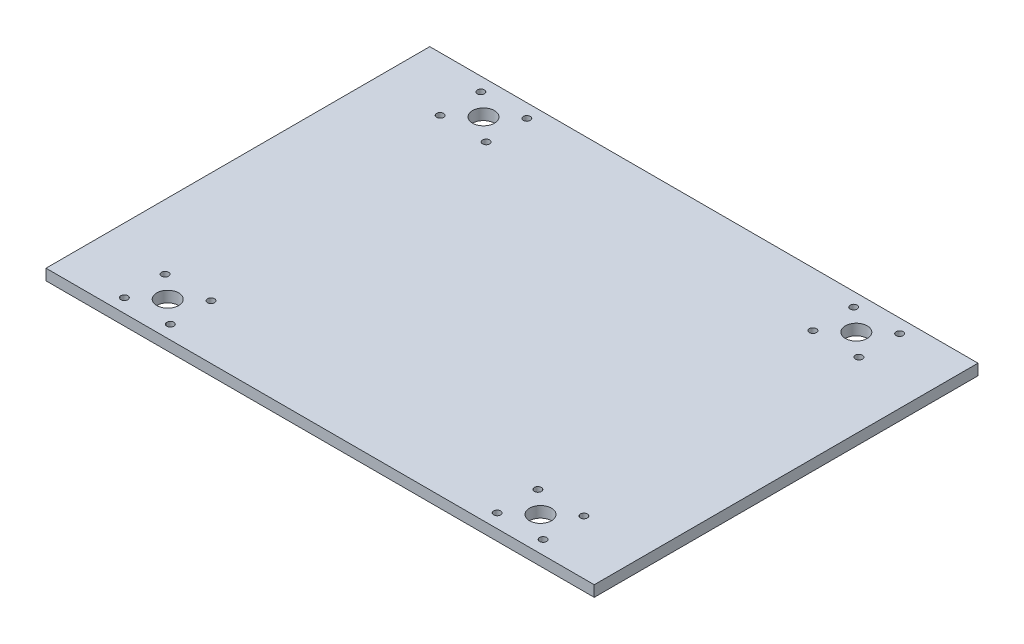
ISO-10303-21;
HEADER;
FILE_DESCRIPTION(('STEP AP214'),'2;1');
FILE_NAME('part.step','',(''),(''),'','','');
FILE_SCHEMA(('AUTOMOTIVE_DESIGN { 1 0 10303 214 1 1 1 1 }'));
ENDSEC;
DATA;
#1=APPLICATION_CONTEXT('core data for automotive mechanical design processes');
#2=APPLICATION_PROTOCOL_DEFINITION('international standard','automotive_design',2000,#1);
#3=PRODUCT_CONTEXT('',#1,'mechanical');
#4=PRODUCT('Part','Part','',(#3));
#5=PRODUCT_RELATED_PRODUCT_CATEGORY('part','',(#4));
#6=PRODUCT_DEFINITION_FORMATION('','',#4);
#7=PRODUCT_DEFINITION_CONTEXT('part definition',#1,'design');
#8=PRODUCT_DEFINITION('design','',#6,#7);
#9=PRODUCT_DEFINITION_SHAPE('','',#8);
#10=(LENGTH_UNIT() NAMED_UNIT(*) SI_UNIT(.MILLI.,.METRE.));
#11=(NAMED_UNIT(*) PLANE_ANGLE_UNIT() SI_UNIT($,.RADIAN.));
#12=(NAMED_UNIT(*) SI_UNIT($,.STERADIAN.) SOLID_ANGLE_UNIT());
#13=UNCERTAINTY_MEASURE_WITH_UNIT(LENGTH_MEASURE(1.E-05),#10,'distance_accuracy_value','');
#14=(GEOMETRIC_REPRESENTATION_CONTEXT(3) GLOBAL_UNCERTAINTY_ASSIGNED_CONTEXT((#13)) GLOBAL_UNIT_ASSIGNED_CONTEXT((#10,
#11,#12)) REPRESENTATION_CONTEXT('',''));
#15=CARTESIAN_POINT('',(0.,0.,0.));
#16=DIRECTION('',(0.,0.,1.));
#17=DIRECTION('',(1.,0.,0.));
#18=AXIS2_PLACEMENT_3D('',#15,#16,#17);
#19=CARTESIAN_POINT('',(0.,5.,0.));
#20=DIRECTION('',(0.,1.,0.));
#21=DIRECTION('',(0.,0.,1.));
#22=AXIS2_PLACEMENT_3D('',#19,#20,#21);
#23=PLANE('',#22);
#24=CARTESIAN_POINT('',(-74.5197654775757,5.,-81.2824934341472));
#25=DIRECTION('',(0.,1.,0.));
#26=DIRECTION('',(0.,0.,-1.));
#27=AXIS2_PLACEMENT_3D('',#24,#25,#26);
#28=CIRCLE('',#27,1.60000000000001);
#29=CARTESIAN_POINT('',(-74.5197654775757,5.,-82.8824934341472));
#30=VERTEX_POINT('',#29);
#31=EDGE_CURVE('E371',#30,#30,#28,.F.);
#32=ORIENTED_EDGE('',*,*,#31,.T.);
#33=EDGE_LOOP('',(#32));
#34=FACE_BOUND('',#33,.T.);
#35=CARTESIAN_POINT('',(-74.5197654775757,5.,-62.7175065658527));
#36=DIRECTION('',(0.,1.,0.));
#37=DIRECTION('',(0.,0.,-1.));
#38=AXIS2_PLACEMENT_3D('',#35,#36,#37);
#39=CIRCLE('',#38,1.60000000000001);
#40=CARTESIAN_POINT('',(-74.5197654775757,5.,-64.3175065658528));
#41=VERTEX_POINT('',#40);
#42=EDGE_CURVE('E377',#41,#41,#39,.T.);
#43=ORIENTED_EDGE('',*,*,#42,.F.);
#44=EDGE_LOOP('',(#43));
#45=FACE_BOUND('',#44,.T.);
#46=CARTESIAN_POINT('',(-85.,5.,-72.));
#47=DIRECTION('',(0.,1.,0.));
#48=DIRECTION('',(0.,0.,-1.));
#49=AXIS2_PLACEMENT_3D('',#46,#47,#48);
#50=CIRCLE('',#49,5.00000000000001);
#51=CARTESIAN_POINT('',(-85.,5.,-77.));
#52=VERTEX_POINT('',#51);
#53=EDGE_CURVE('E176',#52,#52,#50,.T.);
#54=ORIENTED_EDGE('',*,*,#53,.F.);
#55=EDGE_LOOP('',(#54));
#56=FACE_BOUND('',#55,.T.);
#57=CARTESIAN_POINT('',(-95.4802345224243,5.,81.2824934341472));
#58=DIRECTION('',(0.,-1.,0.));
#59=DIRECTION('',(0.,0.,1.));
#60=AXIS2_PLACEMENT_3D('',#57,#58,#59);
#61=CIRCLE('',#60,1.60000000000001);
#62=CARTESIAN_POINT('',(-95.4802345224243,5.,82.8824934341472));
#63=VERTEX_POINT('',#62);
#64=EDGE_CURVE('E190',#63,#63,#61,.T.);
#65=ORIENTED_EDGE('',*,*,#64,.T.);
#66=EDGE_LOOP('',(#65));
#67=FACE_BOUND('',#66,.T.);
#68=CARTESIAN_POINT('',(-74.5197654775757,5.,62.7175065658527));
#69=DIRECTION('',(0.,-1.,0.));
#70=DIRECTION('',(0.,0.,1.));
#71=AXIS2_PLACEMENT_3D('',#68,#69,#70);
#72=CIRCLE('',#71,1.60000000000001);
#73=CARTESIAN_POINT('',(-74.5197654775757,5.,64.3175065658528));
#74=VERTEX_POINT('',#73);
#75=EDGE_CURVE('E201',#74,#74,#72,.T.);
#76=ORIENTED_EDGE('',*,*,#75,.T.);
#77=EDGE_LOOP('',(#76));
#78=FACE_BOUND('',#77,.T.);
#79=CARTESIAN_POINT('',(-85.,5.,72.));
#80=DIRECTION('',(0.,-1.,0.));
#81=DIRECTION('',(0.,0.,1.));
#82=AXIS2_PLACEMENT_3D('',#79,#80,#81);
#83=CIRCLE('',#82,5.00000000000001);
#84=CARTESIAN_POINT('',(-85.,5.,77.));
#85=VERTEX_POINT('',#84);
#86=EDGE_CURVE('E159',#85,#85,#83,.T.);
#87=ORIENTED_EDGE('',*,*,#86,.T.);
#88=EDGE_LOOP('',(#87));
#89=FACE_BOUND('',#88,.T.);
#90=CARTESIAN_POINT('',(95.4802345224243,5.,-81.2824934341472));
#91=DIRECTION('',(0.,-1.,0.));
#92=DIRECTION('',(0.,0.,-1.));
#93=AXIS2_PLACEMENT_3D('',#90,#91,#92);
#94=CIRCLE('',#93,1.60000000000001);
#95=CARTESIAN_POINT('',(95.4802345224243,5.,-82.8824934341472));
#96=VERTEX_POINT('',#95);
#97=EDGE_CURVE('E208',#96,#96,#94,.T.);
#98=ORIENTED_EDGE('',*,*,#97,.T.);
#99=EDGE_LOOP('',(#98));
#100=FACE_BOUND('',#99,.T.);
#101=CARTESIAN_POINT('',(74.5197654775757,5.,-62.7175065658527));
#102=DIRECTION('',(0.,-1.,0.));
#103=DIRECTION('',(0.,0.,-1.));
#104=AXIS2_PLACEMENT_3D('',#101,#102,#103);
#105=CIRCLE('',#104,1.60000000000001);
#106=CARTESIAN_POINT('',(74.5197654775757,5.,-64.3175065658528));
#107=VERTEX_POINT('',#106);
#108=EDGE_CURVE('E202',#107,#107,#105,.T.);
#109=ORIENTED_EDGE('',*,*,#108,.T.);
#110=EDGE_LOOP('',(#109));
#111=FACE_BOUND('',#110,.T.);
#112=CARTESIAN_POINT('',(85.,5.,-72.));
#113=DIRECTION('',(0.,-1.,0.));
#114=DIRECTION('',(0.,0.,-1.));
#115=AXIS2_PLACEMENT_3D('',#112,#113,#114);
#116=CIRCLE('',#115,5.00000000000001);
#117=CARTESIAN_POINT('',(85.,5.,-77.));
#118=VERTEX_POINT('',#117);
#119=EDGE_CURVE('E142',#118,#118,#116,.T.);
#120=ORIENTED_EDGE('',*,*,#119,.T.);
#121=EDGE_LOOP('',(#120));
#122=FACE_BOUND('',#121,.T.);
#123=CARTESIAN_POINT('',(74.5197654775757,5.,81.2824934341472));
#124=DIRECTION('',(0.,1.,0.));
#125=DIRECTION('',(0.,0.,1.));
#126=AXIS2_PLACEMENT_3D('',#123,#124,#125);
#127=CIRCLE('',#126,1.60000000000001);
#128=CARTESIAN_POINT('',(74.5197654775757,5.,82.8824934341472));
#129=VERTEX_POINT('',#128);
#130=EDGE_CURVE('E218',#129,#129,#127,.F.);
#131=ORIENTED_EDGE('',*,*,#130,.T.);
#132=EDGE_LOOP('',(#131));
#133=FACE_BOUND('',#132,.T.);
#134=CARTESIAN_POINT('',(74.5197654775757,5.,62.7175065658527));
#135=DIRECTION('',(0.,1.,0.));
#136=DIRECTION('',(0.,0.,1.));
#137=AXIS2_PLACEMENT_3D('',#134,#135,#136);
#138=CIRCLE('',#137,1.60000000000001);
#139=CARTESIAN_POINT('',(74.5197654775757,5.,64.3175065658528));
#140=VERTEX_POINT('',#139);
#141=EDGE_CURVE('E215',#140,#140,#138,.T.);
#142=ORIENTED_EDGE('',*,*,#141,.F.);
#143=EDGE_LOOP('',(#142));
#144=FACE_BOUND('',#143,.T.);
#145=CARTESIAN_POINT('',(85.,5.,72.));
#146=DIRECTION('',(0.,1.,0.));
#147=DIRECTION('',(0.,0.,1.));
#148=AXIS2_PLACEMENT_3D('',#145,#146,#147);
#149=CIRCLE('',#148,5.00000000000001);
#150=CARTESIAN_POINT('',(85.,5.,77.));
#151=VERTEX_POINT('',#150);
#152=EDGE_CURVE('E127',#151,#151,#149,.T.);
#153=ORIENTED_EDGE('',*,*,#152,.F.);
#154=EDGE_LOOP('',(#153));
#155=FACE_BOUND('',#154,.T.);
#156=DIRECTION('',(0.,0.,1.));
#157=VECTOR('',#156,1.);
#158=CARTESIAN_POINT('',(-125.,5.,0.));
#159=LINE('',#158,#157);
#160=CARTESIAN_POINT('',(-125.,5.,-87.5));
#161=VERTEX_POINT('',#160);
#162=CARTESIAN_POINT('',(-125.,5.,87.5));
#163=VERTEX_POINT('',#162);
#164=EDGE_CURVE('E97',#161,#163,#159,.T.);
#165=ORIENTED_EDGE('',*,*,#164,.T.);
#166=DIRECTION('',(1.,0.,0.));
#167=VECTOR('',#166,1.);
#168=CARTESIAN_POINT('',(0.,5.,87.5000000000001));
#169=LINE('',#168,#167);
#170=CARTESIAN_POINT('',(125.,5.,87.4999999999999));
#171=VERTEX_POINT('',#170);
#172=EDGE_CURVE('E89',#163,#171,#169,.T.);
#173=ORIENTED_EDGE('',*,*,#172,.T.);
#174=DIRECTION('',(0.,0.,1.));
#175=VECTOR('',#174,1.);
#176=CARTESIAN_POINT('',(125.,5.,0.));
#177=LINE('',#176,#175);
#178=CARTESIAN_POINT('',(125.,5.,-87.5000000000001));
#179=VERTEX_POINT('',#178);
#180=EDGE_CURVE('E96',#179,#171,#177,.T.);
#181=ORIENTED_EDGE('',*,*,#180,.F.);
#182=DIRECTION('',(1.,0.,0.));
#183=VECTOR('',#182,1.);
#184=CARTESIAN_POINT('',(0.,5.,-87.5));
#185=LINE('',#184,#183);
#186=EDGE_CURVE('E107',#161,#179,#185,.T.);
#187=ORIENTED_EDGE('',*,*,#186,.F.);
#188=EDGE_LOOP('',(#165,#173,#181,#187));
#189=FACE_BOUND('',#188,.T.);
#190=CARTESIAN_POINT('',(95.4802345224243,5.,81.2824934341472));
#191=DIRECTION('',(0.,1.,0.));
#192=DIRECTION('',(0.,0.,1.));
#193=AXIS2_PLACEMENT_3D('',#190,#191,#192);
#194=CIRCLE('',#193,1.60000000000001);
#195=CARTESIAN_POINT('',(95.4802345224243,5.,82.8824934341472));
#196=VERTEX_POINT('',#195);
#197=EDGE_CURVE('E221',#196,#196,#194,.T.);
#198=ORIENTED_EDGE('',*,*,#197,.F.);
#199=EDGE_LOOP('',(#198));
#200=FACE_BOUND('',#199,.T.);
#201=CARTESIAN_POINT('',(95.4802345224243,5.,62.7175065658527));
#202=DIRECTION('',(0.,1.,0.));
#203=DIRECTION('',(0.,0.,1.));
#204=AXIS2_PLACEMENT_3D('',#201,#202,#203);
#205=CIRCLE('',#204,1.60000000000001);
#206=CARTESIAN_POINT('',(95.4802345224243,5.,64.3175065658528));
#207=VERTEX_POINT('',#206);
#208=EDGE_CURVE('E154',#207,#207,#205,.F.);
#209=ORIENTED_EDGE('',*,*,#208,.T.);
#210=EDGE_LOOP('',(#209));
#211=FACE_BOUND('',#210,.T.);
#212=CARTESIAN_POINT('',(74.5197654775757,5.,-81.2824934341472));
#213=DIRECTION('',(0.,-1.,0.));
#214=DIRECTION('',(0.,0.,-1.));
#215=AXIS2_PLACEMENT_3D('',#212,#213,#214);
#216=CIRCLE('',#215,1.60000000000001);
#217=CARTESIAN_POINT('',(74.5197654775757,5.,-82.8824934341472));
#218=VERTEX_POINT('',#217);
#219=EDGE_CURVE('E205',#218,#218,#216,.F.);
#220=ORIENTED_EDGE('',*,*,#219,.F.);
#221=EDGE_LOOP('',(#220));
#222=FACE_BOUND('',#221,.T.);
#223=CARTESIAN_POINT('',(95.4802345224243,5.,-62.7175065658527));
#224=DIRECTION('',(0.,-1.,0.));
#225=DIRECTION('',(0.,0.,-1.));
#226=AXIS2_PLACEMENT_3D('',#223,#224,#225);
#227=CIRCLE('',#226,1.60000000000001);
#228=CARTESIAN_POINT('',(95.4802345224243,5.,-64.3175065658528));
#229=VERTEX_POINT('',#228);
#230=EDGE_CURVE('E171',#229,#229,#227,.F.);
#231=ORIENTED_EDGE('',*,*,#230,.F.);
#232=EDGE_LOOP('',(#231));
#233=FACE_BOUND('',#232,.T.);
#234=CARTESIAN_POINT('',(-74.5197654775757,5.,81.2824934341472));
#235=DIRECTION('',(0.,-1.,0.));
#236=DIRECTION('',(0.,0.,1.));
#237=AXIS2_PLACEMENT_3D('',#234,#235,#236);
#238=CIRCLE('',#237,1.60000000000001);
#239=CARTESIAN_POINT('',(-74.5197654775757,5.,82.8824934341472));
#240=VERTEX_POINT('',#239);
#241=EDGE_CURVE('E195',#240,#240,#238,.F.);
#242=ORIENTED_EDGE('',*,*,#241,.F.);
#243=EDGE_LOOP('',(#242));
#244=FACE_BOUND('',#243,.T.);
#245=CARTESIAN_POINT('',(-95.4802345224243,5.,62.7175065658527));
#246=DIRECTION('',(0.,-1.,0.));
#247=DIRECTION('',(0.,0.,1.));
#248=AXIS2_PLACEMENT_3D('',#245,#246,#247);
#249=CIRCLE('',#248,1.60000000000001);
#250=CARTESIAN_POINT('',(-95.4802345224243,5.,64.3175065658528));
#251=VERTEX_POINT('',#250);
#252=EDGE_CURVE('E186',#251,#251,#249,.F.);
#253=ORIENTED_EDGE('',*,*,#252,.F.);
#254=EDGE_LOOP('',(#253));
#255=FACE_BOUND('',#254,.T.);
#256=CARTESIAN_POINT('',(-95.4802345224243,5.,-81.2824934341472));
#257=DIRECTION('',(0.,1.,0.));
#258=DIRECTION('',(0.,0.,-1.));
#259=AXIS2_PLACEMENT_3D('',#256,#257,#258);
#260=CIRCLE('',#259,1.60000000000001);
#261=CARTESIAN_POINT('',(-95.4802345224243,5.,-82.8824934341472));
#262=VERTEX_POINT('',#261);
#263=EDGE_CURVE('E366',#262,#262,#260,.T.);
#264=ORIENTED_EDGE('',*,*,#263,.F.);
#265=EDGE_LOOP('',(#264));
#266=FACE_BOUND('',#265,.T.);
#267=CARTESIAN_POINT('',(-95.4802345224243,5.,-62.7175065658527));
#268=DIRECTION('',(0.,1.,0.));
#269=DIRECTION('',(0.,0.,-1.));
#270=AXIS2_PLACEMENT_3D('',#267,#268,#269);
#271=CIRCLE('',#270,1.60000000000001);
#272=CARTESIAN_POINT('',(-95.4802345224243,5.,-64.3175065658528));
#273=VERTEX_POINT('',#272);
#274=EDGE_CURVE('E369',#273,#273,#271,.F.);
#275=ORIENTED_EDGE('',*,*,#274,.T.);
#276=EDGE_LOOP('',(#275));
#277=FACE_BOUND('',#276,.T.);
#278=ADVANCED_FACE('F45',(#34,#45,#56,#67,#78,#89,#100,#111,#122,#133,#144,#155,#189,#200,#211,
#222,#233,#244,#255,#266,#277),#23,.T.);
#279=CARTESIAN_POINT('',(0.,0.,0.));
#280=DIRECTION('',(0.,1.,0.));
#281=DIRECTION('',(0.,0.,1.));
#282=AXIS2_PLACEMENT_3D('',#279,#280,#281);
#283=PLANE('',#282);
#284=CARTESIAN_POINT('',(-95.4802345224243,0.,-81.2824934341472));
#285=DIRECTION('',(0.,1.,0.));
#286=DIRECTION('',(0.,0.,1.));
#287=AXIS2_PLACEMENT_3D('',#284,#285,#286);
#288=CIRCLE('',#287,1.60000000000001);
#289=CARTESIAN_POINT('',(-95.4802345224243,0.,-79.6824934341472));
#290=VERTEX_POINT('',#289);
#291=EDGE_CURVE('E181',#290,#290,#288,.T.);
#292=ORIENTED_EDGE('',*,*,#291,.T.);
#293=EDGE_LOOP('',(#292));
#294=FACE_BOUND('',#293,.T.);
#295=CARTESIAN_POINT('',(-74.5197654775757,0.,-62.7175065658527));
#296=DIRECTION('',(0.,1.,0.));
#297=DIRECTION('',(0.,0.,1.));
#298=AXIS2_PLACEMENT_3D('',#295,#296,#297);
#299=CIRCLE('',#298,1.60000000000001);
#300=CARTESIAN_POINT('',(-74.5197654775757,0.,-61.1175065658527));
#301=VERTEX_POINT('',#300);
#302=EDGE_CURVE('E175',#301,#301,#299,.T.);
#303=ORIENTED_EDGE('',*,*,#302,.T.);
#304=EDGE_LOOP('',(#303));
#305=FACE_BOUND('',#304,.T.);
#306=CARTESIAN_POINT('',(-85.,0.,-72.));
#307=DIRECTION('',(0.,1.,0.));
#308=DIRECTION('',(0.,0.,1.));
#309=AXIS2_PLACEMENT_3D('',#306,#307,#308);
#310=CIRCLE('',#309,5.00000000000001);
#311=CARTESIAN_POINT('',(-85.,0.,-67.));
#312=VERTEX_POINT('',#311);
#313=EDGE_CURVE('E172',#312,#312,#310,.T.);
#314=ORIENTED_EDGE('',*,*,#313,.T.);
#315=EDGE_LOOP('',(#314));
#316=FACE_BOUND('',#315,.T.);
#317=CARTESIAN_POINT('',(-74.5197654775757,0.,81.2824934341472));
#318=DIRECTION('',(0.,1.,0.));
#319=DIRECTION('',(0.,0.,1.));
#320=AXIS2_PLACEMENT_3D('',#317,#318,#319);
#321=CIRCLE('',#320,1.60000000000001);
#322=CARTESIAN_POINT('',(-74.5197654775757,0.,82.8824934341472));
#323=VERTEX_POINT('',#322);
#324=EDGE_CURVE('E162',#323,#323,#321,.T.);
#325=ORIENTED_EDGE('',*,*,#324,.T.);
#326=EDGE_LOOP('',(#325));
#327=FACE_BOUND('',#326,.T.);
#328=CARTESIAN_POINT('',(-74.5197654775757,0.,62.7175065658527));
#329=DIRECTION('',(0.,1.,0.));
#330=DIRECTION('',(0.,0.,1.));
#331=AXIS2_PLACEMENT_3D('',#328,#329,#330);
#332=CIRCLE('',#331,1.60000000000001);
#333=CARTESIAN_POINT('',(-74.5197654775757,0.,64.3175065658528));
#334=VERTEX_POINT('',#333);
#335=EDGE_CURVE('E158',#334,#334,#332,.F.);
#336=ORIENTED_EDGE('',*,*,#335,.F.);
#337=EDGE_LOOP('',(#336));
#338=FACE_BOUND('',#337,.T.);
#339=CARTESIAN_POINT('',(-85.,0.,72.));
#340=DIRECTION('',(0.,1.,0.));
#341=DIRECTION('',(0.,0.,1.));
#342=AXIS2_PLACEMENT_3D('',#339,#340,#341);
#343=CIRCLE('',#342,5.00000000000001);
#344=CARTESIAN_POINT('',(-85.,0.,77.));
#345=VERTEX_POINT('',#344);
#346=EDGE_CURVE('E155',#345,#345,#343,.F.);
#347=ORIENTED_EDGE('',*,*,#346,.F.);
#348=EDGE_LOOP('',(#347));
#349=FACE_BOUND('',#348,.T.);
#350=CARTESIAN_POINT('',(74.5197654775757,0.,-81.2824934341472));
#351=DIRECTION('',(0.,1.,0.));
#352=DIRECTION('',(0.,0.,1.));
#353=AXIS2_PLACEMENT_3D('',#350,#351,#352);
#354=CIRCLE('',#353,1.60000000000001);
#355=CARTESIAN_POINT('',(74.5197654775757,0.,-79.6824934341472));
#356=VERTEX_POINT('',#355);
#357=EDGE_CURVE('E145',#356,#356,#354,.T.);
#358=ORIENTED_EDGE('',*,*,#357,.T.);
#359=EDGE_LOOP('',(#358));
#360=FACE_BOUND('',#359,.T.);
#361=CARTESIAN_POINT('',(74.5197654775757,0.,-62.7175065658527));
#362=DIRECTION('',(0.,1.,0.));
#363=DIRECTION('',(0.,0.,1.));
#364=AXIS2_PLACEMENT_3D('',#361,#362,#363);
#365=CIRCLE('',#364,1.60000000000001);
#366=CARTESIAN_POINT('',(74.5197654775757,0.,-61.1175065658527));
#367=VERTEX_POINT('',#366);
#368=EDGE_CURVE('E141',#367,#367,#365,.F.);
#369=ORIENTED_EDGE('',*,*,#368,.F.);
#370=EDGE_LOOP('',(#369));
#371=FACE_BOUND('',#370,.T.);
#372=CARTESIAN_POINT('',(85.,0.,-72.));
#373=DIRECTION('',(0.,1.,0.));
#374=DIRECTION('',(0.,0.,1.));
#375=AXIS2_PLACEMENT_3D('',#372,#373,#374);
#376=CIRCLE('',#375,5.00000000000001);
#377=CARTESIAN_POINT('',(85.,0.,-67.));
#378=VERTEX_POINT('',#377);
#379=EDGE_CURVE('E138',#378,#378,#376,.F.);
#380=ORIENTED_EDGE('',*,*,#379,.F.);
#381=EDGE_LOOP('',(#380));
#382=FACE_BOUND('',#381,.T.);
#383=CARTESIAN_POINT('',(95.4802345224243,0.,81.2824934341472));
#384=DIRECTION('',(0.,1.,0.));
#385=DIRECTION('',(0.,0.,1.));
#386=AXIS2_PLACEMENT_3D('',#383,#384,#385);
#387=CIRCLE('',#386,1.60000000000001);
#388=CARTESIAN_POINT('',(95.4802345224243,0.,82.8824934341472));
#389=VERTEX_POINT('',#388);
#390=EDGE_CURVE('E133',#389,#389,#387,.T.);
#391=ORIENTED_EDGE('',*,*,#390,.T.);
#392=EDGE_LOOP('',(#391));
#393=FACE_BOUND('',#392,.T.);
#394=CARTESIAN_POINT('',(74.5197654775757,0.,62.7175065658527));
#395=DIRECTION('',(0.,1.,0.));
#396=DIRECTION('',(0.,0.,1.));
#397=AXIS2_PLACEMENT_3D('',#394,#395,#396);
#398=CIRCLE('',#397,1.60000000000001);
#399=CARTESIAN_POINT('',(74.5197654775757,0.,64.3175065658528));
#400=VERTEX_POINT('',#399);
#401=EDGE_CURVE('E126',#400,#400,#398,.T.);
#402=ORIENTED_EDGE('',*,*,#401,.T.);
#403=EDGE_LOOP('',(#402));
#404=FACE_BOUND('',#403,.T.);
#405=CARTESIAN_POINT('',(85.,0.,72.));
#406=DIRECTION('',(0.,1.,0.));
#407=DIRECTION('',(0.,0.,1.));
#408=AXIS2_PLACEMENT_3D('',#405,#406,#407);
#409=CIRCLE('',#408,5.00000000000001);
#410=CARTESIAN_POINT('',(85.,0.,77.));
#411=VERTEX_POINT('',#410);
#412=EDGE_CURVE('E123',#411,#411,#409,.T.);
#413=ORIENTED_EDGE('',*,*,#412,.T.);
#414=EDGE_LOOP('',(#413));
#415=FACE_BOUND('',#414,.T.);
#416=DIRECTION('',(0.,0.,1.));
#417=VECTOR('',#416,1.);
#418=CARTESIAN_POINT('',(-125.,0.,0.));
#419=LINE('',#418,#417);
#420=CARTESIAN_POINT('',(-125.,0.,-87.5));
#421=VERTEX_POINT('',#420);
#422=CARTESIAN_POINT('',(-125.,0.,87.5));
#423=VERTEX_POINT('',#422);
#424=EDGE_CURVE('E112',#421,#423,#419,.T.);
#425=ORIENTED_EDGE('',*,*,#424,.F.);
#426=DIRECTION('',(1.,0.,0.));
#427=VECTOR('',#426,1.);
#428=CARTESIAN_POINT('',(0.,0.,-87.5));
#429=LINE('',#428,#427);
#430=CARTESIAN_POINT('',(125.,0.,-87.5000000000001));
#431=VERTEX_POINT('',#430);
#432=EDGE_CURVE('E118',#421,#431,#429,.T.);
#433=ORIENTED_EDGE('',*,*,#432,.T.);
#434=DIRECTION('',(0.,0.,1.));
#435=VECTOR('',#434,1.);
#436=CARTESIAN_POINT('',(125.,0.,0.));
#437=LINE('',#436,#435);
#438=CARTESIAN_POINT('',(125.,0.,87.4999999999999));
#439=VERTEX_POINT('',#438);
#440=EDGE_CURVE('E116',#431,#439,#437,.T.);
#441=ORIENTED_EDGE('',*,*,#440,.T.);
#442=DIRECTION('',(1.,0.,0.));
#443=VECTOR('',#442,1.);
#444=CARTESIAN_POINT('',(0.,0.,87.5000000000001));
#445=LINE('',#444,#443);
#446=EDGE_CURVE('E102',#423,#439,#445,.T.);
#447=ORIENTED_EDGE('',*,*,#446,.F.);
#448=EDGE_LOOP('',(#425,#433,#441,#447));
#449=FACE_BOUND('',#448,.T.);
#450=CARTESIAN_POINT('',(74.5197654775757,0.,81.2824934341472));
#451=DIRECTION('',(0.,1.,0.));
#452=DIRECTION('',(0.,0.,1.));
#453=AXIS2_PLACEMENT_3D('',#450,#451,#452);
#454=CIRCLE('',#453,1.60000000000001);
#455=CARTESIAN_POINT('',(74.5197654775757,0.,82.8824934341472));
#456=VERTEX_POINT('',#455);
#457=EDGE_CURVE('E130',#456,#456,#454,.F.);
#458=ORIENTED_EDGE('',*,*,#457,.F.);
#459=EDGE_LOOP('',(#458));
#460=FACE_BOUND('',#459,.T.);
#461=CARTESIAN_POINT('',(95.4802345224243,0.,62.7175065658527));
#462=DIRECTION('',(0.,1.,0.));
#463=DIRECTION('',(0.,0.,1.));
#464=AXIS2_PLACEMENT_3D('',#461,#462,#463);
#465=CIRCLE('',#464,1.60000000000001);
#466=CARTESIAN_POINT('',(95.4802345224243,0.,64.3175065658528));
#467=VERTEX_POINT('',#466);
#468=EDGE_CURVE('E114',#467,#467,#465,.F.);
#469=ORIENTED_EDGE('',*,*,#468,.F.);
#470=EDGE_LOOP('',(#469));
#471=FACE_BOUND('',#470,.T.);
#472=CARTESIAN_POINT('',(95.4802345224243,0.,-81.2824934341472));
#473=DIRECTION('',(0.,1.,0.));
#474=DIRECTION('',(0.,0.,1.));
#475=AXIS2_PLACEMENT_3D('',#472,#473,#474);
#476=CIRCLE('',#475,1.60000000000001);
#477=CARTESIAN_POINT('',(95.4802345224243,0.,-79.6824934341472));
#478=VERTEX_POINT('',#477);
#479=EDGE_CURVE('E148',#478,#478,#476,.F.);
#480=ORIENTED_EDGE('',*,*,#479,.F.);
#481=EDGE_LOOP('',(#480));
#482=FACE_BOUND('',#481,.T.);
#483=CARTESIAN_POINT('',(95.4802345224243,0.,-62.7175065658527));
#484=DIRECTION('',(0.,1.,0.));
#485=DIRECTION('',(0.,0.,1.));
#486=AXIS2_PLACEMENT_3D('',#483,#484,#485);
#487=CIRCLE('',#486,1.60000000000001);
#488=CARTESIAN_POINT('',(95.4802345224243,0.,-61.1175065658527));
#489=VERTEX_POINT('',#488);
#490=EDGE_CURVE('E151',#489,#489,#487,.T.);
#491=ORIENTED_EDGE('',*,*,#490,.T.);
#492=EDGE_LOOP('',(#491));
#493=FACE_BOUND('',#492,.T.);
#494=CARTESIAN_POINT('',(-95.4802345224243,0.,81.2824934341472));
#495=DIRECTION('',(0.,1.,0.));
#496=DIRECTION('',(0.,0.,1.));
#497=AXIS2_PLACEMENT_3D('',#494,#495,#496);
#498=CIRCLE('',#497,1.60000000000001);
#499=CARTESIAN_POINT('',(-95.4802345224243,0.,82.8824934341472));
#500=VERTEX_POINT('',#499);
#501=EDGE_CURVE('E165',#500,#500,#498,.F.);
#502=ORIENTED_EDGE('',*,*,#501,.F.);
#503=EDGE_LOOP('',(#502));
#504=FACE_BOUND('',#503,.T.);
#505=CARTESIAN_POINT('',(-95.4802345224243,0.,62.7175065658527));
#506=DIRECTION('',(0.,1.,0.));
#507=DIRECTION('',(0.,0.,1.));
#508=AXIS2_PLACEMENT_3D('',#505,#506,#507);
#509=CIRCLE('',#508,1.60000000000001);
#510=CARTESIAN_POINT('',(-95.4802345224243,0.,64.3175065658528));
#511=VERTEX_POINT('',#510);
#512=EDGE_CURVE('E168',#511,#511,#509,.T.);
#513=ORIENTED_EDGE('',*,*,#512,.T.);
#514=EDGE_LOOP('',(#513));
#515=FACE_BOUND('',#514,.T.);
#516=CARTESIAN_POINT('',(-74.5197654775757,0.,-81.2824934341472));
#517=DIRECTION('',(0.,1.,0.));
#518=DIRECTION('',(0.,0.,1.));
#519=AXIS2_PLACEMENT_3D('',#516,#517,#518);
#520=CIRCLE('',#519,1.60000000000001);
#521=CARTESIAN_POINT('',(-74.5197654775757,0.,-79.6824934341472));
#522=VERTEX_POINT('',#521);
#523=EDGE_CURVE('E179',#522,#522,#520,.F.);
#524=ORIENTED_EDGE('',*,*,#523,.F.);
#525=EDGE_LOOP('',(#524));
#526=FACE_BOUND('',#525,.T.);
#527=CARTESIAN_POINT('',(-95.4802345224243,0.,-62.7175065658527));
#528=DIRECTION('',(0.,1.,0.));
#529=DIRECTION('',(0.,0.,1.));
#530=AXIS2_PLACEMENT_3D('',#527,#528,#529);
#531=CIRCLE('',#530,1.60000000000001);
#532=CARTESIAN_POINT('',(-95.4802345224243,0.,-61.1175065658527));
#533=VERTEX_POINT('',#532);
#534=EDGE_CURVE('E49',#533,#533,#531,.F.);
#535=ORIENTED_EDGE('',*,*,#534,.F.);
#536=EDGE_LOOP('',(#535));
#537=FACE_BOUND('',#536,.T.);
#538=ADVANCED_FACE('F233',(#294,#305,#316,#327,#338,#349,#360,#371,#382,#393,#404,#415,#449,
#460,#471,#482,#493,#504,#515,#526,#537),#283,.F.);
#539=CARTESIAN_POINT('',(-125.,5.,0.));
#540=DIRECTION('',(1.,0.,0.));
#541=DIRECTION('',(0.,0.,-1.));
#542=AXIS2_PLACEMENT_3D('',#539,#540,#541);
#543=PLANE('',#542);
#544=ORIENTED_EDGE('',*,*,#424,.T.);
#545=DIRECTION('',(0.,-1.,0.));
#546=VECTOR('',#545,1.);
#547=CARTESIAN_POINT('',(-125.,5.,87.5));
#548=LINE('',#547,#546);
#549=EDGE_CURVE('E11',#163,#423,#548,.T.);
#550=ORIENTED_EDGE('',*,*,#549,.F.);
#551=ORIENTED_EDGE('',*,*,#164,.F.);
#552=DIRECTION('',(0.,-1.,0.));
#553=VECTOR('',#552,1.);
#554=CARTESIAN_POINT('',(-125.,5.,-87.5));
#555=LINE('',#554,#553);
#556=EDGE_CURVE('E64',#161,#421,#555,.T.);
#557=ORIENTED_EDGE('',*,*,#556,.T.);
#558=EDGE_LOOP('',(#544,#550,#551,#557));
#559=FACE_BOUND('',#558,.T.);
#560=ADVANCED_FACE('F47',(#559),#543,.F.);
#561=CARTESIAN_POINT('',(0.,5.,87.5000000000001));
#562=DIRECTION('',(0.,0.,-1.));
#563=DIRECTION('',(-1.,0.,0.));
#564=AXIS2_PLACEMENT_3D('',#561,#562,#563);
#565=PLANE('',#564);
#566=ORIENTED_EDGE('',*,*,#446,.T.);
#567=DIRECTION('',(0.,-1.,0.));
#568=VECTOR('',#567,1.);
#569=CARTESIAN_POINT('',(125.,5.,87.4999999999999));
#570=LINE('',#569,#568);
#571=EDGE_CURVE('E55',#171,#439,#570,.T.);
#572=ORIENTED_EDGE('',*,*,#571,.F.);
#573=ORIENTED_EDGE('',*,*,#172,.F.);
#574=ORIENTED_EDGE('',*,*,#549,.T.);
#575=EDGE_LOOP('',(#566,#572,#573,#574));
#576=FACE_BOUND('',#575,.T.);
#577=ADVANCED_FACE('F101',(#576),#565,.F.);
#578=CARTESIAN_POINT('',(125.,5.,0.));
#579=DIRECTION('',(1.,0.,0.));
#580=DIRECTION('',(0.,0.,-1.));
#581=AXIS2_PLACEMENT_3D('',#578,#579,#580);
#582=PLANE('',#581);
#583=ORIENTED_EDGE('',*,*,#440,.F.);
#584=DIRECTION('',(0.,-1.,0.));
#585=VECTOR('',#584,1.);
#586=CARTESIAN_POINT('',(125.,5.,-87.5000000000001));
#587=LINE('',#586,#585);
#588=EDGE_CURVE('E78',#179,#431,#587,.T.);
#589=ORIENTED_EDGE('',*,*,#588,.F.);
#590=ORIENTED_EDGE('',*,*,#180,.T.);
#591=ORIENTED_EDGE('',*,*,#571,.T.);
#592=EDGE_LOOP('',(#583,#589,#590,#591));
#593=FACE_BOUND('',#592,.T.);
#594=ADVANCED_FACE('F106',(#593),#582,.T.);
#595=CARTESIAN_POINT('',(0.,5.,-87.5));
#596=DIRECTION('',(0.,0.,-1.));
#597=DIRECTION('',(-1.,0.,0.));
#598=AXIS2_PLACEMENT_3D('',#595,#596,#597);
#599=PLANE('',#598);
#600=ORIENTED_EDGE('',*,*,#432,.F.);
#601=ORIENTED_EDGE('',*,*,#556,.F.);
#602=ORIENTED_EDGE('',*,*,#186,.T.);
#603=ORIENTED_EDGE('',*,*,#588,.T.);
#604=EDGE_LOOP('',(#600,#601,#602,#603));
#605=FACE_BOUND('',#604,.T.);
#606=ADVANCED_FACE('F245',(#605),#599,.T.);
#607=CARTESIAN_POINT('',(85.,-5.,72.));
#608=DIRECTION('',(0.,1.,0.));
#609=DIRECTION('',(0.,0.,1.));
#610=AXIS2_PLACEMENT_3D('',#607,#608,#609);
#611=CYLINDRICAL_SURFACE('',#610,5.00000000000001);
#612=ORIENTED_EDGE('',*,*,#152,.T.);
#613=EDGE_LOOP('',(#612));
#614=FACE_BOUND('',#613,.T.);
#615=ORIENTED_EDGE('',*,*,#412,.F.);
#616=EDGE_LOOP('',(#615));
#617=FACE_BOUND('',#616,.T.);
#618=ADVANCED_FACE('F229',(#614,#617),#611,.F.);
#619=CARTESIAN_POINT('',(74.5197654775757,-5.,62.7175065658527));
#620=DIRECTION('',(0.,1.,0.));
#621=DIRECTION('',(0.,0.,1.));
#622=AXIS2_PLACEMENT_3D('',#619,#620,#621);
#623=CYLINDRICAL_SURFACE('',#622,1.60000000000001);
#624=ORIENTED_EDGE('',*,*,#141,.T.);
#625=EDGE_LOOP('',(#624));
#626=FACE_BOUND('',#625,.T.);
#627=ORIENTED_EDGE('',*,*,#401,.F.);
#628=EDGE_LOOP('',(#627));
#629=FACE_BOUND('',#628,.T.);
#630=ADVANCED_FACE('F336',(#626,#629),#623,.F.);
#631=CARTESIAN_POINT('',(74.5197654775757,-5.,81.2824934341472));
#632=DIRECTION('',(0.,1.,0.));
#633=DIRECTION('',(0.,0.,1.));
#634=AXIS2_PLACEMENT_3D('',#631,#632,#633);
#635=CYLINDRICAL_SURFACE('',#634,1.60000000000001);
#636=ORIENTED_EDGE('',*,*,#130,.F.);
#637=EDGE_LOOP('',(#636));
#638=FACE_BOUND('',#637,.T.);
#639=ORIENTED_EDGE('',*,*,#457,.T.);
#640=EDGE_LOOP('',(#639));
#641=FACE_BOUND('',#640,.T.);
#642=ADVANCED_FACE('F339',(#638,#641),#635,.F.);
#643=CARTESIAN_POINT('',(95.4802345224243,-5.,81.2824934341472));
#644=DIRECTION('',(0.,1.,0.));
#645=DIRECTION('',(0.,0.,1.));
#646=AXIS2_PLACEMENT_3D('',#643,#644,#645);
#647=CYLINDRICAL_SURFACE('',#646,1.60000000000001);
#648=ORIENTED_EDGE('',*,*,#197,.T.);
#649=EDGE_LOOP('',(#648));
#650=FACE_BOUND('',#649,.T.);
#651=ORIENTED_EDGE('',*,*,#390,.F.);
#652=EDGE_LOOP('',(#651));
#653=FACE_BOUND('',#652,.T.);
#654=ADVANCED_FACE('F343',(#650,#653),#647,.F.);
#655=CARTESIAN_POINT('',(95.4802345224243,-5.,62.7175065658527));
#656=DIRECTION('',(0.,1.,0.));
#657=DIRECTION('',(0.,0.,1.));
#658=AXIS2_PLACEMENT_3D('',#655,#656,#657);
#659=CYLINDRICAL_SURFACE('',#658,1.60000000000001);
#660=ORIENTED_EDGE('',*,*,#208,.F.);
#661=EDGE_LOOP('',(#660));
#662=FACE_BOUND('',#661,.T.);
#663=ORIENTED_EDGE('',*,*,#468,.T.);
#664=EDGE_LOOP('',(#663));
#665=FACE_BOUND('',#664,.T.);
#666=ADVANCED_FACE('F334',(#662,#665),#659,.F.);
#667=CARTESIAN_POINT('',(85.,-5.,-72.));
#668=DIRECTION('',(0.,1.,0.));
#669=DIRECTION('',(0.,0.,1.));
#670=AXIS2_PLACEMENT_3D('',#667,#668,#669);
#671=CYLINDRICAL_SURFACE('',#670,5.00000000000001);
#672=ORIENTED_EDGE('',*,*,#119,.F.);
#673=EDGE_LOOP('',(#672));
#674=FACE_BOUND('',#673,.T.);
#675=ORIENTED_EDGE('',*,*,#379,.T.);
#676=EDGE_LOOP('',(#675));
#677=FACE_BOUND('',#676,.T.);
#678=ADVANCED_FACE('F320',(#674,#677),#671,.F.);
#679=CARTESIAN_POINT('',(74.5197654775757,-5.,-62.7175065658527));
#680=DIRECTION('',(0.,1.,0.));
#681=DIRECTION('',(0.,0.,1.));
#682=AXIS2_PLACEMENT_3D('',#679,#680,#681);
#683=CYLINDRICAL_SURFACE('',#682,1.60000000000001);
#684=ORIENTED_EDGE('',*,*,#108,.F.);
#685=EDGE_LOOP('',(#684));
#686=FACE_BOUND('',#685,.T.);
#687=ORIENTED_EDGE('',*,*,#368,.T.);
#688=EDGE_LOOP('',(#687));
#689=FACE_BOUND('',#688,.T.);
#690=ADVANCED_FACE('F316',(#686,#689),#683,.F.);
#691=CARTESIAN_POINT('',(74.5197654775757,-5.,-81.2824934341472));
#692=DIRECTION('',(0.,1.,0.));
#693=DIRECTION('',(0.,0.,1.));
#694=AXIS2_PLACEMENT_3D('',#691,#692,#693);
#695=CYLINDRICAL_SURFACE('',#694,1.60000000000001);
#696=ORIENTED_EDGE('',*,*,#219,.T.);
#697=EDGE_LOOP('',(#696));
#698=FACE_BOUND('',#697,.T.);
#699=ORIENTED_EDGE('',*,*,#357,.F.);
#700=EDGE_LOOP('',(#699));
#701=FACE_BOUND('',#700,.T.);
#702=ADVANCED_FACE('F319',(#698,#701),#695,.F.);
#703=CARTESIAN_POINT('',(95.4802345224243,-5.,-81.2824934341472));
#704=DIRECTION('',(0.,1.,0.));
#705=DIRECTION('',(0.,0.,1.));
#706=AXIS2_PLACEMENT_3D('',#703,#704,#705);
#707=CYLINDRICAL_SURFACE('',#706,1.60000000000001);
#708=ORIENTED_EDGE('',*,*,#97,.F.);
#709=EDGE_LOOP('',(#708));
#710=FACE_BOUND('',#709,.T.);
#711=ORIENTED_EDGE('',*,*,#479,.T.);
#712=EDGE_LOOP('',(#711));
#713=FACE_BOUND('',#712,.T.);
#714=ADVANCED_FACE('F324',(#710,#713),#707,.F.);
#715=CARTESIAN_POINT('',(95.4802345224243,-5.,-62.7175065658527));
#716=DIRECTION('',(0.,1.,0.));
#717=DIRECTION('',(0.,0.,1.));
#718=AXIS2_PLACEMENT_3D('',#715,#716,#717);
#719=CYLINDRICAL_SURFACE('',#718,1.60000000000001);
#720=ORIENTED_EDGE('',*,*,#230,.T.);
#721=EDGE_LOOP('',(#720));
#722=FACE_BOUND('',#721,.T.);
#723=ORIENTED_EDGE('',*,*,#490,.F.);
#724=EDGE_LOOP('',(#723));
#725=FACE_BOUND('',#724,.T.);
#726=ADVANCED_FACE('F314',(#722,#725),#719,.F.);
#727=CARTESIAN_POINT('',(-85.,-5.,72.));
#728=DIRECTION('',(0.,1.,0.));
#729=DIRECTION('',(0.,0.,1.));
#730=AXIS2_PLACEMENT_3D('',#727,#728,#729);
#731=CYLINDRICAL_SURFACE('',#730,5.00000000000001);
#732=ORIENTED_EDGE('',*,*,#86,.F.);
#733=EDGE_LOOP('',(#732));
#734=FACE_BOUND('',#733,.T.);
#735=ORIENTED_EDGE('',*,*,#346,.T.);
#736=EDGE_LOOP('',(#735));
#737=FACE_BOUND('',#736,.T.);
#738=ADVANCED_FACE('F301',(#734,#737),#731,.F.);
#739=CARTESIAN_POINT('',(-74.5197654775757,-5.,62.7175065658527));
#740=DIRECTION('',(0.,1.,0.));
#741=DIRECTION('',(0.,0.,1.));
#742=AXIS2_PLACEMENT_3D('',#739,#740,#741);
#743=CYLINDRICAL_SURFACE('',#742,1.60000000000001);
#744=ORIENTED_EDGE('',*,*,#75,.F.);
#745=EDGE_LOOP('',(#744));
#746=FACE_BOUND('',#745,.T.);
#747=ORIENTED_EDGE('',*,*,#335,.T.);
#748=EDGE_LOOP('',(#747));
#749=FACE_BOUND('',#748,.T.);
#750=ADVANCED_FACE('F297',(#746,#749),#743,.F.);
#751=CARTESIAN_POINT('',(-74.5197654775757,-5.,81.2824934341472));
#752=DIRECTION('',(0.,1.,0.));
#753=DIRECTION('',(0.,0.,1.));
#754=AXIS2_PLACEMENT_3D('',#751,#752,#753);
#755=CYLINDRICAL_SURFACE('',#754,1.60000000000001);
#756=ORIENTED_EDGE('',*,*,#241,.T.);
#757=EDGE_LOOP('',(#756));
#758=FACE_BOUND('',#757,.T.);
#759=ORIENTED_EDGE('',*,*,#324,.F.);
#760=EDGE_LOOP('',(#759));
#761=FACE_BOUND('',#760,.T.);
#762=ADVANCED_FACE('F300',(#758,#761),#755,.F.);
#763=CARTESIAN_POINT('',(-95.4802345224243,-5.,81.2824934341472));
#764=DIRECTION('',(0.,1.,0.));
#765=DIRECTION('',(0.,0.,1.));
#766=AXIS2_PLACEMENT_3D('',#763,#764,#765);
#767=CYLINDRICAL_SURFACE('',#766,1.60000000000001);
#768=ORIENTED_EDGE('',*,*,#64,.F.);
#769=EDGE_LOOP('',(#768));
#770=FACE_BOUND('',#769,.T.);
#771=ORIENTED_EDGE('',*,*,#501,.T.);
#772=EDGE_LOOP('',(#771));
#773=FACE_BOUND('',#772,.T.);
#774=ADVANCED_FACE('F305',(#770,#773),#767,.F.);
#775=CARTESIAN_POINT('',(-95.4802345224243,-5.,62.7175065658527));
#776=DIRECTION('',(0.,1.,0.));
#777=DIRECTION('',(0.,0.,1.));
#778=AXIS2_PLACEMENT_3D('',#775,#776,#777);
#779=CYLINDRICAL_SURFACE('',#778,1.60000000000001);
#780=ORIENTED_EDGE('',*,*,#252,.T.);
#781=EDGE_LOOP('',(#780));
#782=FACE_BOUND('',#781,.T.);
#783=ORIENTED_EDGE('',*,*,#512,.F.);
#784=EDGE_LOOP('',(#783));
#785=FACE_BOUND('',#784,.T.);
#786=ADVANCED_FACE('F295',(#782,#785),#779,.F.);
#787=CARTESIAN_POINT('',(-85.,-5.,-72.));
#788=DIRECTION('',(0.,1.,0.));
#789=DIRECTION('',(0.,0.,1.));
#790=AXIS2_PLACEMENT_3D('',#787,#788,#789);
#791=CYLINDRICAL_SURFACE('',#790,5.00000000000001);
#792=ORIENTED_EDGE('',*,*,#53,.T.);
#793=EDGE_LOOP('',(#792));
#794=FACE_BOUND('',#793,.T.);
#795=ORIENTED_EDGE('',*,*,#313,.F.);
#796=EDGE_LOOP('',(#795));
#797=FACE_BOUND('',#796,.T.);
#798=ADVANCED_FACE('F285',(#794,#797),#791,.F.);
#799=CARTESIAN_POINT('',(-74.5197654775757,-5.,-62.7175065658527));
#800=DIRECTION('',(0.,1.,0.));
#801=DIRECTION('',(0.,0.,1.));
#802=AXIS2_PLACEMENT_3D('',#799,#800,#801);
#803=CYLINDRICAL_SURFACE('',#802,1.60000000000001);
#804=ORIENTED_EDGE('',*,*,#42,.T.);
#805=EDGE_LOOP('',(#804));
#806=FACE_BOUND('',#805,.T.);
#807=ORIENTED_EDGE('',*,*,#302,.F.);
#808=EDGE_LOOP('',(#807));
#809=FACE_BOUND('',#808,.T.);
#810=ADVANCED_FACE('F275',(#806,#809),#803,.F.);
#811=CARTESIAN_POINT('',(-74.5197654775757,-5.,-81.2824934341472));
#812=DIRECTION('',(0.,1.,0.));
#813=DIRECTION('',(0.,0.,1.));
#814=AXIS2_PLACEMENT_3D('',#811,#812,#813);
#815=CYLINDRICAL_SURFACE('',#814,1.60000000000001);
#816=ORIENTED_EDGE('',*,*,#31,.F.);
#817=EDGE_LOOP('',(#816));
#818=FACE_BOUND('',#817,.T.);
#819=ORIENTED_EDGE('',*,*,#523,.T.);
#820=EDGE_LOOP('',(#819));
#821=FACE_BOUND('',#820,.T.);
#822=ADVANCED_FACE('F272',(#818,#821),#815,.F.);
#823=CARTESIAN_POINT('',(-95.4802345224243,-5.,-81.2824934341472));
#824=DIRECTION('',(0.,1.,0.));
#825=DIRECTION('',(0.,0.,1.));
#826=AXIS2_PLACEMENT_3D('',#823,#824,#825);
#827=CYLINDRICAL_SURFACE('',#826,1.60000000000001);
#828=ORIENTED_EDGE('',*,*,#263,.T.);
#829=EDGE_LOOP('',(#828));
#830=FACE_BOUND('',#829,.T.);
#831=ORIENTED_EDGE('',*,*,#291,.F.);
#832=EDGE_LOOP('',(#831));
#833=FACE_BOUND('',#832,.T.);
#834=ADVANCED_FACE('F274',(#830,#833),#827,.F.);
#835=CARTESIAN_POINT('',(-95.4802345224243,-5.,-62.7175065658527));
#836=DIRECTION('',(0.,1.,0.));
#837=DIRECTION('',(0.,0.,1.));
#838=AXIS2_PLACEMENT_3D('',#835,#836,#837);
#839=CYLINDRICAL_SURFACE('',#838,1.60000000000001);
#840=ORIENTED_EDGE('',*,*,#274,.F.);
#841=EDGE_LOOP('',(#840));
#842=FACE_BOUND('',#841,.T.);
#843=ORIENTED_EDGE('',*,*,#534,.T.);
#844=EDGE_LOOP('',(#843));
#845=FACE_BOUND('',#844,.T.);
#846=ADVANCED_FACE('F282',(#842,#845),#839,.F.);
#847=CLOSED_SHELL('',(#278,#538,#560,#577,#594,#606,#618,#630,#642,#654,#666,#678,#690,#702,
#714,#726,#738,#750,#762,#774,#786,#798,#810,#822,#834,#846));
#848=MANIFOLD_SOLID_BREP('B2',#847);
#849=ADVANCED_BREP_SHAPE_REPRESENTATION('',(#18,#848),#14);
#850=SHAPE_DEFINITION_REPRESENTATION(#9,#849);
ENDSEC;
END-ISO-10303-21;
